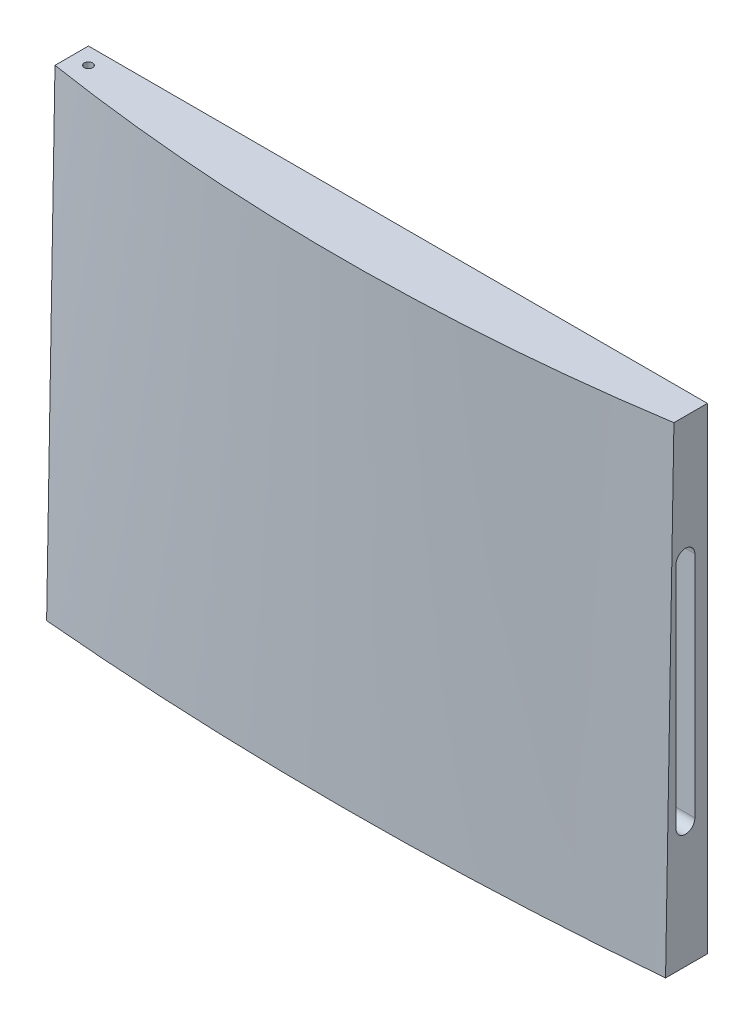
ISO-10303-21;
HEADER;
FILE_DESCRIPTION(('STEP AP214'),'2;1');
FILE_NAME('part.step','',(''),(''),'','','');
FILE_SCHEMA(('AUTOMOTIVE_DESIGN { 1 0 10303 214 1 1 1 1 }'));
ENDSEC;
DATA;
#1=APPLICATION_CONTEXT('core data for automotive mechanical design processes');
#2=APPLICATION_PROTOCOL_DEFINITION('international standard','automotive_design',2000,#1);
#3=PRODUCT_CONTEXT('',#1,'mechanical');
#4=PRODUCT('Part','Part','',(#3));
#5=PRODUCT_RELATED_PRODUCT_CATEGORY('part','',(#4));
#6=PRODUCT_DEFINITION_FORMATION('','',#4);
#7=PRODUCT_DEFINITION_CONTEXT('part definition',#1,'design');
#8=PRODUCT_DEFINITION('design','',#6,#7);
#9=PRODUCT_DEFINITION_SHAPE('','',#8);
#10=(LENGTH_UNIT() NAMED_UNIT(*) SI_UNIT(.MILLI.,.METRE.));
#11=(NAMED_UNIT(*) PLANE_ANGLE_UNIT() SI_UNIT($,.RADIAN.));
#12=(NAMED_UNIT(*) SI_UNIT($,.STERADIAN.) SOLID_ANGLE_UNIT());
#13=UNCERTAINTY_MEASURE_WITH_UNIT(LENGTH_MEASURE(1.E-05),#10,'distance_accuracy_value','');
#14=(GEOMETRIC_REPRESENTATION_CONTEXT(3) GLOBAL_UNCERTAINTY_ASSIGNED_CONTEXT((#13)) GLOBAL_UNIT_ASSIGNED_CONTEXT((#10,
#11,#12)) REPRESENTATION_CONTEXT('',''));
#15=CARTESIAN_POINT('',(0.,0.,0.));
#16=DIRECTION('',(0.,0.,1.));
#17=DIRECTION('',(1.,0.,0.));
#18=AXIS2_PLACEMENT_3D('',#15,#16,#17);
#19=CARTESIAN_POINT('',(0.,0.,0.));
#20=DIRECTION('',(0.,0.,-1.));
#21=DIRECTION('',(0.,1.,0.));
#22=AXIS2_PLACEMENT_3D('',#19,#20,#21);
#23=PLANE('',#22);
#24=DIRECTION('',(0.,-1.,0.));
#25=VECTOR('',#24,1.);
#26=CARTESIAN_POINT('',(-320.856761827083,10.,0.));
#27=LINE('',#26,#25);
#28=CARTESIAN_POINT('',(-320.856761827083,10.,0.));
#29=VERTEX_POINT('',#28);
#30=CARTESIAN_POINT('',(-320.856761827083,0.,0.));
#31=VERTEX_POINT('',#30);
#32=EDGE_CURVE('E270',#29,#31,#27,.T.);
#33=ORIENTED_EDGE('',*,*,#32,.F.);
#34=DIRECTION('',(1.,0.,0.));
#35=VECTOR('',#34,1.);
#36=CARTESIAN_POINT('',(-370.,10.,0.));
#37=LINE('',#36,#35);
#38=CARTESIAN_POINT('',(-370.,10.,0.));
#39=VERTEX_POINT('',#38);
#40=EDGE_CURVE('E267',#39,#29,#37,.T.);
#41=ORIENTED_EDGE('',*,*,#40,.F.);
#42=DIRECTION('',(0.,-1.,0.));
#43=VECTOR('',#42,1.);
#44=CARTESIAN_POINT('',(-370.,570.,0.));
#45=LINE('',#44,#43);
#46=CARTESIAN_POINT('',(-370.,570.,0.));
#47=VERTEX_POINT('',#46);
#48=EDGE_CURVE('E385',#47,#39,#45,.T.);
#49=ORIENTED_EDGE('',*,*,#48,.F.);
#50=DIRECTION('',(-1.,0.,0.));
#51=VECTOR('',#50,1.);
#52=CARTESIAN_POINT('',(-370.,570.,0.));
#53=LINE('',#52,#51);
#54=CARTESIAN_POINT('',(370.,570.,0.));
#55=VERTEX_POINT('',#54);
#56=EDGE_CURVE('E289',#55,#47,#53,.T.);
#57=ORIENTED_EDGE('',*,*,#56,.F.);
#58=DIRECTION('',(0.,-1.,0.));
#59=VECTOR('',#58,1.);
#60=CARTESIAN_POINT('',(370.,570.,0.));
#61=LINE('',#60,#59);
#62=CARTESIAN_POINT('',(370.,0.,-1.35935794705356E-13));
#63=VERTEX_POINT('',#62);
#64=EDGE_CURVE('E295',#55,#63,#61,.T.);
#65=ORIENTED_EDGE('',*,*,#64,.T.);
#66=DIRECTION('',(-1.,0.,0.));
#67=VECTOR('',#66,1.);
#68=CARTESIAN_POINT('',(-370.,0.,0.));
#69=LINE('',#68,#67);
#70=EDGE_CURVE('E460',#63,#31,#69,.T.);
#71=ORIENTED_EDGE('',*,*,#70,.T.);
#72=EDGE_LOOP('',(#33,#41,#49,#57,#65,#71));
#73=FACE_BOUND('',#72,.T.);
#74=CARTESIAN_POINT('',(335.,535.,0.));
#75=DIRECTION('',(0.,0.,-1.));
#76=DIRECTION('',(0.,1.,0.));
#77=AXIS2_PLACEMENT_3D('',#74,#75,#76);
#78=CIRCLE('',#77,20.);
#79=CARTESIAN_POINT('',(335.,555.,0.));
#80=VERTEX_POINT('',#79);
#81=CARTESIAN_POINT('',(355.,535.,0.));
#82=VERTEX_POINT('',#81);
#83=EDGE_CURVE('E499',#80,#82,#78,.T.);
#84=ORIENTED_EDGE('',*,*,#83,.F.);
#85=DIRECTION('',(1.,0.,0.));
#86=VECTOR('',#85,1.);
#87=CARTESIAN_POINT('',(0.,555.,0.));
#88=LINE('',#87,#86);
#89=CARTESIAN_POINT('',(-325.,555.,1.24092171055707E-13));
#90=VERTEX_POINT('',#89);
#91=EDGE_CURVE('E496',#80,#90,#88,.F.);
#92=ORIENTED_EDGE('',*,*,#91,.T.);
#93=CARTESIAN_POINT('',(-325.,535.,1.196959198424E-13));
#94=DIRECTION('',(0.,0.,-1.));
#95=DIRECTION('',(0.,1.,0.));
#96=AXIS2_PLACEMENT_3D('',#93,#94,#95);
#97=CIRCLE('',#96,20.);
#98=CARTESIAN_POINT('',(-345.,535.,1.22996434445944E-13));
#99=VERTEX_POINT('',#98);
#100=EDGE_CURVE('E493',#99,#90,#97,.T.);
#101=ORIENTED_EDGE('',*,*,#100,.F.);
#102=DIRECTION('',(0.,1.,0.));
#103=VECTOR('',#102,1.);
#104=CARTESIAN_POINT('',(-345.,0.,0.));
#105=LINE('',#104,#103);
#106=CARTESIAN_POINT('',(-345.,45.,0.));
#107=VERTEX_POINT('',#106);
#108=EDGE_CURVE('E489',#99,#107,#105,.F.);
#109=ORIENTED_EDGE('',*,*,#108,.T.);
#110=CARTESIAN_POINT('',(-325.,45.,0.));
#111=DIRECTION('',(0.,0.,-1.));
#112=DIRECTION('',(0.,1.,0.));
#113=AXIS2_PLACEMENT_3D('',#110,#111,#112);
#114=CIRCLE('',#113,20.);
#115=CARTESIAN_POINT('',(-325.,25.,0.));
#116=VERTEX_POINT('',#115);
#117=EDGE_CURVE('E486',#116,#107,#114,.T.);
#118=ORIENTED_EDGE('',*,*,#117,.F.);
#119=DIRECTION('',(-1.,0.,0.));
#120=VECTOR('',#119,1.);
#121=CARTESIAN_POINT('',(0.,25.,0.));
#122=LINE('',#121,#120);
#123=CARTESIAN_POINT('',(335.,24.9999999999999,-1.23544302750826E-13));
#124=VERTEX_POINT('',#123);
#125=EDGE_CURVE('E484',#116,#124,#122,.F.);
#126=ORIENTED_EDGE('',*,*,#125,.T.);
#127=CARTESIAN_POINT('',(335.,44.9999999999999,-1.17961196366423E-13));
#128=DIRECTION('',(0.,0.,-1.));
#129=DIRECTION('',(0.,1.,0.));
#130=AXIS2_PLACEMENT_3D('',#127,#128,#129);
#131=CIRCLE('',#130,20.);
#132=CARTESIAN_POINT('',(355.,44.9999999999999,-1.22448566141062E-13));
#133=VERTEX_POINT('',#132);
#134=EDGE_CURVE('E481',#133,#124,#131,.T.);
#135=ORIENTED_EDGE('',*,*,#134,.F.);
#136=DIRECTION('',(0.,-1.,0.));
#137=VECTOR('',#136,1.);
#138=CARTESIAN_POINT('',(355.,0.,-1.33180339407275E-13));
#139=LINE('',#138,#137);
#140=EDGE_CURVE('E491',#133,#82,#139,.F.);
#141=ORIENTED_EDGE('',*,*,#140,.T.);
#142=EDGE_LOOP('',(#84,#92,#101,#109,#118,#126,#135,#141));
#143=FACE_BOUND('',#142,.T.);
#144=ADVANCED_FACE('F56',(#73,#143),#23,.T.);
#145=CARTESIAN_POINT('',(-7.7715611723761E-13,0.,-4133.67063713194));
#146=DIRECTION('',(0.,1.,0.));
#147=DIRECTION('',(0.,0.,1.));
#148=AXIS2_PLACEMENT_3D('',#145,#146,#147);
#149=PLANE('',#148);
#150=DIRECTION('',(1.,0.,0.));
#151=VECTOR('',#150,1.);
#152=CARTESIAN_POINT('',(-370.,0.,25.4419169748149));
#153=LINE('',#152,#151);
#154=CARTESIAN_POINT('',(-370.,0.,25.4419169748149));
#155=VERTEX_POINT('',#154);
#156=CARTESIAN_POINT('',(-335.856761827083,0.,25.4419169748149));
#157=VERTEX_POINT('',#156);
#158=EDGE_CURVE('E254',#155,#157,#153,.T.);
#159=ORIENTED_EDGE('',*,*,#158,.T.);
#160=CARTESIAN_POINT('',(-335.856761827083,0.,10.4419169748149));
#161=DIRECTION('',(0.,1.,0.));
#162=DIRECTION('',(0.,0.,1.));
#163=AXIS2_PLACEMENT_3D('',#160,#161,#162);
#164=CIRCLE('',#163,15.);
#165=CARTESIAN_POINT('',(-320.856761827083,0.,10.4419169748148));
#166=VERTEX_POINT('',#165);
#167=EDGE_CURVE('E271',#157,#166,#164,.T.);
#168=ORIENTED_EDGE('',*,*,#167,.T.);
#169=DIRECTION('',(0.,0.,1.));
#170=VECTOR('',#169,1.);
#171=CARTESIAN_POINT('',(-320.856761827083,0.,0.));
#172=LINE('',#171,#170);
#173=EDGE_CURVE('E260',#31,#166,#172,.T.);
#174=ORIENTED_EDGE('',*,*,#173,.F.);
#175=ORIENTED_EDGE('',*,*,#70,.F.);
#176=DIRECTION('',(0.,0.,-1.));
#177=VECTOR('',#176,1.);
#178=CARTESIAN_POINT('',(370.,0.,-1.35935794705356E-13));
#179=LINE('',#178,#177);
#180=CARTESIAN_POINT('',(370.,0.,49.9999999999999));
#181=VERTEX_POINT('',#180);
#182=EDGE_CURVE('E327',#181,#63,#179,.T.);
#183=ORIENTED_EDGE('',*,*,#182,.F.);
#184=CARTESIAN_POINT('',(-7.7715611723761E-13,0.,-4133.67063713194));
#185=DIRECTION('',(0.,1.,0.));
#186=DIRECTION('',(0.,0.,1.));
#187=AXIS2_PLACEMENT_3D('',#184,#185,#186);
#188=CIRCLE('',#187,4200.);
#189=CARTESIAN_POINT('',(-370.,0.,49.9999999999989));
#190=VERTEX_POINT('',#189);
#191=EDGE_CURVE('E342',#190,#181,#188,.T.);
#192=ORIENTED_EDGE('',*,*,#191,.F.);
#193=DIRECTION('',(0.,0.,1.));
#194=VECTOR('',#193,1.);
#195=CARTESIAN_POINT('',(-370.,0.,0.));
#196=LINE('',#195,#194);
#197=EDGE_CURVE('E410',#155,#190,#196,.T.);
#198=ORIENTED_EDGE('',*,*,#197,.F.);
#199=EDGE_LOOP('',(#159,#168,#174,#175,#183,#192,#198));
#200=FACE_BOUND('',#199,.T.);
#201=ADVANCED_FACE('F306',(#200),#149,.F.);
#202=CARTESIAN_POINT('',(-370.,0.,0.));
#203=DIRECTION('',(-1.,0.,0.));
#204=DIRECTION('',(0.,0.,1.));
#205=AXIS2_PLACEMENT_3D('',#202,#203,#204);
#206=PLANE('',#205);
#207=DIRECTION('',(0.,0.,1.));
#208=VECTOR('',#207,1.);
#209=CARTESIAN_POINT('',(-370.,10.,0.));
#210=LINE('',#209,#208);
#211=CARTESIAN_POINT('',(-370.,10.,25.4419169748149));
#212=VERTEX_POINT('',#211);
#213=EDGE_CURVE('E256',#39,#212,#210,.T.);
#214=ORIENTED_EDGE('',*,*,#213,.T.);
#215=DIRECTION('',(0.,-1.,0.));
#216=VECTOR('',#215,1.);
#217=CARTESIAN_POINT('',(-370.,10.,25.4419169748149));
#218=LINE('',#217,#216);
#219=EDGE_CURVE('E278',#212,#155,#218,.T.);
#220=ORIENTED_EDGE('',*,*,#219,.T.);
#221=ORIENTED_EDGE('',*,*,#197,.T.);
#222=DIRECTION('',(0.,-0.999846142010013,0.0175411603861394));
#223=VECTOR('',#222,1.);
#224=CARTESIAN_POINT('',(-370.000000000001,285.,44.9999999999993));
#225=LINE('',#224,#223);
#226=CARTESIAN_POINT('',(-370.000000000001,570.,39.9999999999996));
#227=VERTEX_POINT('',#226);
#228=EDGE_CURVE('E378',#227,#190,#225,.T.);
#229=ORIENTED_EDGE('',*,*,#228,.F.);
#230=DIRECTION('',(0.,0.,1.));
#231=VECTOR('',#230,1.);
#232=CARTESIAN_POINT('',(-370.,570.,0.));
#233=LINE('',#232,#231);
#234=EDGE_CURVE('E282',#47,#227,#233,.T.);
#235=ORIENTED_EDGE('',*,*,#234,.F.);
#236=ORIENTED_EDGE('',*,*,#48,.T.);
#237=EDGE_LOOP('',(#214,#220,#221,#229,#235,#236));
#238=FACE_BOUND('',#237,.T.);
#239=ADVANCED_FACE('F364',(#238),#206,.T.);
#240=CARTESIAN_POINT('',(0.,570.,-2331.30765612562));
#241=DIRECTION('',(0.,1.,0.));
#242=DIRECTION('',(0.,0.,1.));
#243=AXIS2_PLACEMENT_3D('',#240,#241,#242);
#244=PLANE('',#243);
#245=CARTESIAN_POINT('',(-350.,570.,19.9999999999999));
#246=DIRECTION('',(0.,1.,0.));
#247=DIRECTION('',(0.,0.,1.));
#248=AXIS2_PLACEMENT_3D('',#245,#246,#247);
#249=CIRCLE('',#248,4.99999999999999);
#250=CARTESIAN_POINT('',(-350.,570.,24.9999999999999));
#251=VERTEX_POINT('',#250);
#252=EDGE_CURVE('E279',#251,#251,#249,.F.);
#253=ORIENTED_EDGE('',*,*,#252,.T.);
#254=EDGE_LOOP('',(#253));
#255=FACE_BOUND('',#254,.T.);
#256=ORIENTED_EDGE('',*,*,#234,.T.);
#257=CARTESIAN_POINT('',(0.,570.,-2331.30765612562));
#258=DIRECTION('',(0.,1.,0.));
#259=DIRECTION('',(0.,0.,1.));
#260=AXIS2_PLACEMENT_3D('',#257,#258,#259);
#261=CIRCLE('',#260,2400.);
#262=CARTESIAN_POINT('',(370.000000000001,570.,39.9999999999996));
#263=VERTEX_POINT('',#262);
#264=EDGE_CURVE('E404',#227,#263,#261,.T.);
#265=ORIENTED_EDGE('',*,*,#264,.T.);
#266=DIRECTION('',(0.,0.,-1.));
#267=VECTOR('',#266,1.);
#268=CARTESIAN_POINT('',(370.,570.,0.));
#269=LINE('',#268,#267);
#270=EDGE_CURVE('E416',#263,#55,#269,.T.);
#271=ORIENTED_EDGE('',*,*,#270,.T.);
#272=ORIENTED_EDGE('',*,*,#56,.T.);
#273=EDGE_LOOP('',(#256,#265,#271,#272));
#274=FACE_BOUND('',#273,.T.);
#275=ADVANCED_FACE('F361',(#255,#274),#244,.T.);
#276=CARTESIAN_POINT('',(370.000000000001,570.,39.9999999999996));
#277=CARTESIAN_POINT('',(370.000000000001,0.,49.9999999999989));
#278=CARTESIAN_POINT('',(309.070567168995,570.,49.5069444444441));
#279=CARTESIAN_POINT('',(308.573089851635,0.,55.4325396825386));
#280=CARTESIAN_POINT('',(247.591525258771,570.,56.6905729641538));
#281=CARTESIAN_POINT('',(246.966712257081,0.,59.5168537694138));
#282=CARTESIAN_POINT('',(124.074720951034,570.,66.2833367538543));
#283=CARTESIAN_POINT('',(123.573527567323,0.,64.9652692189822));
#284=CARTESIAN_POINT('',(62.0375002689213,570.,68.6923438743758));
#285=CARTESIAN_POINT('',(61.7867784196749,0.,66.3293628680557));
#286=CARTESIAN_POINT('',(-62.0375002689218,570.,68.6923438743759));
#287=CARTESIAN_POINT('',(-61.7867784196738,0.,66.3293628680557));
#288=CARTESIAN_POINT('',(-124.074720951035,570.,66.2833367538543));
#289=CARTESIAN_POINT('',(-123.573527567322,0.,64.9652692189822));
#290=CARTESIAN_POINT('',(-247.591525258772,570.,56.6905729641538));
#291=CARTESIAN_POINT('',(-246.96671225708,0.,59.5168537694137));
#292=CARTESIAN_POINT('',(-309.070567168996,570.,49.5069444444441));
#293=CARTESIAN_POINT('',(-308.573089851634,0.,55.4325396825386));
#294=CARTESIAN_POINT('',(-370.000000000001,570.,39.9999999999996));
#295=CARTESIAN_POINT('',(-370.,0.,49.9999999999989));
#296=B_SPLINE_SURFACE_WITH_KNOTS('',3,1,((#276,#277),(#278,#279),(#280,#281),(#282,#283),(#284,
#285),(#286,#287),(#288,#289),(#290,#291),(#292,#293),(#294,#295)),.UNSPECIFIED.,.F.,.F.,.F.,(4,
2,2,2,4),(2,2),(0.,0.25,0.5,0.75,1.),(0.,1.),.UNSPECIFIED.);
#297=DIRECTION('',(0.,0.999846142010013,-0.0175411603861394));
#298=VECTOR('',#297,1.);
#299=CARTESIAN_POINT('',(370.000000000001,285.,44.9999999999993));
#300=LINE('',#299,#298);
#301=EDGE_CURVE('E386',#181,#263,#300,.T.);
#302=ORIENTED_EDGE('',*,*,#264,.F.);
#303=ORIENTED_EDGE('',*,*,#228,.T.);
#304=ORIENTED_EDGE('',*,*,#191,.T.);
#305=ORIENTED_EDGE('',*,*,#301,.T.);
#306=EDGE_LOOP('',(#302,#303,#304,#305));
#307=FACE_BOUND('',#306,.T.);
#308=ADVANCED_FACE('F350',(#307),#296,.T.);
#309=CARTESIAN_POINT('',(370.,0.,0.));
#310=DIRECTION('',(1.,0.,0.));
#311=DIRECTION('',(0.,0.,-1.));
#312=AXIS2_PLACEMENT_3D('',#309,#310,#311);
#313=PLANE('',#312);
#314=CARTESIAN_POINT('',(370.,148.2,26.2500000000001));
#315=DIRECTION('',(1.,0.,0.));
#316=DIRECTION('',(0.,0.,1.));
#317=AXIS2_PLACEMENT_3D('',#314,#315,#316);
#318=CIRCLE('',#317,11.25);
#319=CARTESIAN_POINT('',(370.,148.2,37.5000000000001));
#320=VERTEX_POINT('',#319);
#321=CARTESIAN_POINT('',(370.,148.2,15.0000000000001));
#322=VERTEX_POINT('',#321);
#323=EDGE_CURVE('E236',#320,#322,#318,.T.);
#324=ORIENTED_EDGE('',*,*,#323,.F.);
#325=DIRECTION('',(0.,-1.,0.));
#326=VECTOR('',#325,1.);
#327=CARTESIAN_POINT('',(370.,148.2,37.5000000000001));
#328=LINE('',#327,#326);
#329=CARTESIAN_POINT('',(370.,421.8,37.5000000000001));
#330=VERTEX_POINT('',#329);
#331=EDGE_CURVE('E241',#330,#320,#328,.T.);
#332=ORIENTED_EDGE('',*,*,#331,.F.);
#333=CARTESIAN_POINT('',(370.,421.8,26.2500000000001));
#334=DIRECTION('',(1.,0.,0.));
#335=DIRECTION('',(0.,0.,-1.));
#336=AXIS2_PLACEMENT_3D('',#333,#334,#335);
#337=CIRCLE('',#336,11.25);
#338=CARTESIAN_POINT('',(370.,421.8,15.0000000000001));
#339=VERTEX_POINT('',#338);
#340=EDGE_CURVE('E223',#339,#330,#337,.T.);
#341=ORIENTED_EDGE('',*,*,#340,.F.);
#342=DIRECTION('',(0.,1.,0.));
#343=VECTOR('',#342,1.);
#344=CARTESIAN_POINT('',(370.,148.2,15.0000000000001));
#345=LINE('',#344,#343);
#346=EDGE_CURVE('E231',#322,#339,#345,.T.);
#347=ORIENTED_EDGE('',*,*,#346,.F.);
#348=EDGE_LOOP('',(#324,#332,#341,#347));
#349=FACE_BOUND('',#348,.T.);
#350=ORIENTED_EDGE('',*,*,#301,.F.);
#351=ORIENTED_EDGE('',*,*,#182,.T.);
#352=ORIENTED_EDGE('',*,*,#64,.F.);
#353=ORIENTED_EDGE('',*,*,#270,.F.);
#354=EDGE_LOOP('',(#350,#351,#352,#353));
#355=FACE_BOUND('',#354,.T.);
#356=ADVANCED_FACE('F238',(#349,#355),#313,.T.);
#357=CARTESIAN_POINT('',(-350.,570.009369636747,19.9999999999999));
#358=DIRECTION('',(0.,-1.,0.));
#359=DIRECTION('',(0.,0.,-1.));
#360=AXIS2_PLACEMENT_3D('',#357,#358,#359);
#361=CYLINDRICAL_SURFACE('',#360,4.99999999999999);
#362=CARTESIAN_POINT('',(-350.,10.,19.9999999999999));
#363=DIRECTION('',(0.,1.,0.));
#364=DIRECTION('',(0.,0.,1.));
#365=AXIS2_PLACEMENT_3D('',#362,#363,#364);
#366=CIRCLE('',#365,4.99999999999999);
#367=CARTESIAN_POINT('',(-350.,10.,24.9999999999999));
#368=VERTEX_POINT('',#367);
#369=EDGE_CURVE('E283',#368,#368,#366,.F.);
#370=ORIENTED_EDGE('',*,*,#369,.T.);
#371=EDGE_LOOP('',(#370));
#372=FACE_BOUND('',#371,.T.);
#373=ORIENTED_EDGE('',*,*,#252,.F.);
#374=EDGE_LOOP('',(#373));
#375=FACE_BOUND('',#374,.T.);
#376=ADVANCED_FACE('F720',(#372,#375),#361,.F.);
#377=CARTESIAN_POINT('',(-335.856761827083,10.,10.4419169748149));
#378=DIRECTION('',(0.,1.,0.));
#379=DIRECTION('',(0.,0.,1.));
#380=AXIS2_PLACEMENT_3D('',#377,#378,#379);
#381=PLANE('',#380);
#382=ORIENTED_EDGE('',*,*,#213,.F.);
#383=ORIENTED_EDGE('',*,*,#40,.T.);
#384=DIRECTION('',(0.,0.,1.));
#385=VECTOR('',#384,1.);
#386=CARTESIAN_POINT('',(-320.856761827083,10.,0.));
#387=LINE('',#386,#385);
#388=CARTESIAN_POINT('',(-320.856761827083,10.,10.4419169748148));
#389=VERTEX_POINT('',#388);
#390=EDGE_CURVE('E264',#29,#389,#387,.T.);
#391=ORIENTED_EDGE('',*,*,#390,.T.);
#392=CARTESIAN_POINT('',(-335.856761827083,10.,10.4419169748149));
#393=DIRECTION('',(0.,1.,0.));
#394=DIRECTION('',(0.,0.,1.));
#395=AXIS2_PLACEMENT_3D('',#392,#393,#394);
#396=CIRCLE('',#395,15.);
#397=CARTESIAN_POINT('',(-335.856761827083,10.,25.4419169748149));
#398=VERTEX_POINT('',#397);
#399=EDGE_CURVE('E262',#398,#389,#396,.T.);
#400=ORIENTED_EDGE('',*,*,#399,.F.);
#401=DIRECTION('',(1.,0.,0.));
#402=VECTOR('',#401,1.);
#403=CARTESIAN_POINT('',(-370.,10.,25.4419169748149));
#404=LINE('',#403,#402);
#405=EDGE_CURVE('E259',#212,#398,#404,.T.);
#406=ORIENTED_EDGE('',*,*,#405,.F.);
#407=EDGE_LOOP('',(#382,#383,#391,#400,#406));
#408=FACE_BOUND('',#407,.T.);
#409=ORIENTED_EDGE('',*,*,#369,.F.);
#410=EDGE_LOOP('',(#409));
#411=FACE_BOUND('',#410,.T.);
#412=ADVANCED_FACE('F716',(#408,#411),#381,.F.);
#413=CARTESIAN_POINT('',(-370.,10.,25.4419169748149));
#414=DIRECTION('',(0.,0.,-1.));
#415=DIRECTION('',(-1.,0.,0.));
#416=AXIS2_PLACEMENT_3D('',#413,#414,#415);
#417=PLANE('',#416);
#418=ORIENTED_EDGE('',*,*,#158,.F.);
#419=ORIENTED_EDGE('',*,*,#219,.F.);
#420=ORIENTED_EDGE('',*,*,#405,.T.);
#421=DIRECTION('',(0.,-1.,0.));
#422=VECTOR('',#421,1.);
#423=CARTESIAN_POINT('',(-335.856761827083,10.,25.4419169748149));
#424=LINE('',#423,#422);
#425=EDGE_CURVE('E276',#398,#157,#424,.T.);
#426=ORIENTED_EDGE('',*,*,#425,.T.);
#427=EDGE_LOOP('',(#418,#419,#420,#426));
#428=FACE_BOUND('',#427,.T.);
#429=ADVANCED_FACE('F719',(#428),#417,.T.);
#430=CARTESIAN_POINT('',(-335.856761827083,10.,10.4419169748149));
#431=DIRECTION('',(0.,-1.,0.));
#432=DIRECTION('',(0.,0.,-1.));
#433=AXIS2_PLACEMENT_3D('',#430,#431,#432);
#434=CYLINDRICAL_SURFACE('',#433,15.);
#435=ORIENTED_EDGE('',*,*,#167,.F.);
#436=ORIENTED_EDGE('',*,*,#425,.F.);
#437=ORIENTED_EDGE('',*,*,#399,.T.);
#438=DIRECTION('',(0.,-1.,0.));
#439=VECTOR('',#438,1.);
#440=CARTESIAN_POINT('',(-320.856761827083,10.,10.4419169748148));
#441=LINE('',#440,#439);
#442=EDGE_CURVE('E274',#389,#166,#441,.T.);
#443=ORIENTED_EDGE('',*,*,#442,.T.);
#444=EDGE_LOOP('',(#435,#436,#437,#443));
#445=FACE_BOUND('',#444,.T.);
#446=ADVANCED_FACE('F724',(#445),#434,.F.);
#447=CARTESIAN_POINT('',(-320.856761827083,10.,0.));
#448=DIRECTION('',(1.,0.,0.));
#449=DIRECTION('',(0.,0.,-1.));
#450=AXIS2_PLACEMENT_3D('',#447,#448,#449);
#451=PLANE('',#450);
#452=ORIENTED_EDGE('',*,*,#173,.T.);
#453=ORIENTED_EDGE('',*,*,#442,.F.);
#454=ORIENTED_EDGE('',*,*,#390,.F.);
#455=ORIENTED_EDGE('',*,*,#32,.T.);
#456=EDGE_LOOP('',(#452,#453,#454,#455));
#457=FACE_BOUND('',#456,.T.);
#458=ADVANCED_FACE('F712',(#457),#451,.F.);
#459=CARTESIAN_POINT('',(-335.,545.,-19.9999999999999));
#460=DIRECTION('',(0.,-1.,0.));
#461=DIRECTION('',(1.,0.,0.));
#462=AXIS2_PLACEMENT_3D('',#459,#460,#461);
#463=PLANE('',#462);
#464=DIRECTION('',(1.,0.,0.));
#465=VECTOR('',#464,1.);
#466=CARTESIAN_POINT('',(-335.,545.,-9.99999999999988));
#467=LINE('',#466,#465);
#468=CARTESIAN_POINT('',(-325.,545.,-9.99999999999988));
#469=VERTEX_POINT('',#468);
#470=CARTESIAN_POINT('',(335.,545.,-10.));
#471=VERTEX_POINT('',#470);
#472=EDGE_CURVE('E476',#469,#471,#467,.T.);
#473=ORIENTED_EDGE('',*,*,#472,.T.);
#474=DIRECTION('',(0.,0.,1.));
#475=VECTOR('',#474,1.);
#476=CARTESIAN_POINT('',(335.,545.,-20.));
#477=LINE('',#476,#475);
#478=CARTESIAN_POINT('',(335.,545.,-20.));
#479=VERTEX_POINT('',#478);
#480=EDGE_CURVE('E479',#471,#479,#477,.F.);
#481=ORIENTED_EDGE('',*,*,#480,.T.);
#482=DIRECTION('',(1.,0.,0.));
#483=VECTOR('',#482,1.);
#484=CARTESIAN_POINT('',(-335.,545.,-19.9999999999999));
#485=LINE('',#484,#483);
#486=CARTESIAN_POINT('',(-325.,545.,-19.9999999999999));
#487=VERTEX_POINT('',#486);
#488=EDGE_CURVE('E251',#487,#479,#485,.T.);
#489=ORIENTED_EDGE('',*,*,#488,.F.);
#490=DIRECTION('',(0.,0.,1.));
#491=VECTOR('',#490,1.);
#492=CARTESIAN_POINT('',(-325.,545.,-19.9999999999999));
#493=LINE('',#492,#491);
#494=EDGE_CURVE('E463',#487,#469,#493,.T.);
#495=ORIENTED_EDGE('',*,*,#494,.T.);
#496=EDGE_LOOP('',(#473,#481,#489,#495));
#497=FACE_BOUND('',#496,.T.);
#498=ADVANCED_FACE('F689',(#497),#463,.F.);
#499=CARTESIAN_POINT('',(0.,0.,-20.));
#500=DIRECTION('',(0.,0.,-1.));
#501=DIRECTION('',(-1.,0.,0.));
#502=AXIS2_PLACEMENT_3D('',#499,#500,#501);
#503=PLANE('',#502);
#504=ORIENTED_EDGE('',*,*,#488,.T.);
#505=DIRECTION('',(0.,-1.,0.));
#506=VECTOR('',#505,1.);
#507=CARTESIAN_POINT('',(335.,34.9999999999999,-20.0000000000001));
#508=LINE('',#507,#506);
#509=CARTESIAN_POINT('',(335.,44.9999999999999,-20.0000000000001));
#510=VERTEX_POINT('',#509);
#511=EDGE_CURVE('E506',#479,#510,#508,.T.);
#512=ORIENTED_EDGE('',*,*,#511,.T.);
#513=DIRECTION('',(-1.,0.,0.));
#514=VECTOR('',#513,1.);
#515=CARTESIAN_POINT('',(-335.,45.,-19.9999999999999));
#516=LINE('',#515,#514);
#517=CARTESIAN_POINT('',(-325.,45.,-19.9999999999999));
#518=VERTEX_POINT('',#517);
#519=EDGE_CURVE('E502',#510,#518,#516,.T.);
#520=ORIENTED_EDGE('',*,*,#519,.T.);
#521=DIRECTION('',(0.,1.,0.));
#522=VECTOR('',#521,1.);
#523=CARTESIAN_POINT('',(-325.,545.,-19.9999999999999));
#524=LINE('',#523,#522);
#525=EDGE_CURVE('E504',#518,#487,#524,.T.);
#526=ORIENTED_EDGE('',*,*,#525,.T.);
#527=EDGE_LOOP('',(#504,#512,#520,#526));
#528=FACE_BOUND('',#527,.T.);
#529=ADVANCED_FACE('F618',(#528),#503,.T.);
#530=CARTESIAN_POINT('',(0.,45.,-9.99999999999999));
#531=DIRECTION('',(1.,0.,0.));
#532=DIRECTION('',(0.,0.,-1.));
#533=AXIS2_PLACEMENT_3D('',#530,#531,#532);
#534=CYLINDRICAL_SURFACE('',#533,10.);
#535=DIRECTION('',(-1.,0.,0.));
#536=VECTOR('',#535,1.);
#537=CARTESIAN_POINT('',(345.,34.9999999999999,-10.0000000000001));
#538=LINE('',#537,#536);
#539=CARTESIAN_POINT('',(-325.,35.,-9.99999999999994));
#540=VERTEX_POINT('',#539);
#541=CARTESIAN_POINT('',(335.,34.9999999999999,-10.0000000000001));
#542=VERTEX_POINT('',#541);
#543=EDGE_CURVE('E556',#540,#542,#538,.F.);
#544=ORIENTED_EDGE('',*,*,#543,.F.);
#545=CARTESIAN_POINT('',(-325.,45.,-9.99999999999993));
#546=DIRECTION('',(-1.,0.,0.));
#547=DIRECTION('',(0.,0.,1.));
#548=AXIS2_PLACEMENT_3D('',#545,#546,#547);
#549=CIRCLE('',#548,10.);
#550=EDGE_CURVE('E255',#518,#540,#549,.T.);
#551=ORIENTED_EDGE('',*,*,#550,.F.);
#552=ORIENTED_EDGE('',*,*,#519,.F.);
#553=CARTESIAN_POINT('',(335.,44.9999999999999,-10.0000000000001));
#554=DIRECTION('',(1.,0.,0.));
#555=DIRECTION('',(0.,0.,-1.));
#556=AXIS2_PLACEMENT_3D('',#553,#554,#555);
#557=CIRCLE('',#556,10.);
#558=EDGE_CURVE('E562',#542,#510,#557,.T.);
#559=ORIENTED_EDGE('',*,*,#558,.F.);
#560=EDGE_LOOP('',(#544,#551,#552,#559));
#561=FACE_BOUND('',#560,.T.);
#562=ADVANCED_FACE('F614',(#561),#534,.T.);
#563=CARTESIAN_POINT('',(-325.,45.,-9.99999999999993));
#564=DIRECTION('',(0.,0.,1.));
#565=DIRECTION('',(1.,0.,0.));
#566=AXIS2_PLACEMENT_3D('',#563,#564,#565);
#567=SPHERICAL_SURFACE('',#566,10.);
#568=ORIENTED_EDGE('',*,*,#550,.T.);
#569=CARTESIAN_POINT('',(-325.,45.,-10.));
#570=DIRECTION('',(0.,0.,-1.));
#571=DIRECTION('',(0.,1.,0.));
#572=AXIS2_PLACEMENT_3D('',#569,#570,#571);
#573=CIRCLE('',#572,10.);
#574=CARTESIAN_POINT('',(-335.,45.,-10.));
#575=VERTEX_POINT('',#574);
#576=EDGE_CURVE('E551',#575,#540,#573,.F.);
#577=ORIENTED_EDGE('',*,*,#576,.F.);
#578=CARTESIAN_POINT('',(-325.,45.,-9.99999999999993));
#579=DIRECTION('',(0.,-1.,0.));
#580=DIRECTION('',(0.,0.,-1.));
#581=AXIS2_PLACEMENT_3D('',#578,#579,#580);
#582=CIRCLE('',#581,10.);
#583=EDGE_CURVE('E548',#518,#575,#582,.F.);
#584=ORIENTED_EDGE('',*,*,#583,.F.);
#585=EDGE_LOOP('',(#568,#577,#584));
#586=FACE_BOUND('',#585,.T.);
#587=ADVANCED_FACE('F617',(#586),#567,.T.);
#588=CARTESIAN_POINT('',(335.,44.9999999999999,-10.0000000000001));
#589=DIRECTION('',(0.,0.,1.));
#590=DIRECTION('',(1.,0.,0.));
#591=AXIS2_PLACEMENT_3D('',#588,#589,#590);
#592=SPHERICAL_SURFACE('',#591,10.);
#593=CARTESIAN_POINT('',(335.,44.9999999999999,-10.0000000000001));
#594=DIRECTION('',(0.,0.,-1.));
#595=DIRECTION('',(0.,1.,0.));
#596=AXIS2_PLACEMENT_3D('',#593,#594,#595);
#597=CIRCLE('',#596,10.);
#598=CARTESIAN_POINT('',(345.,44.9999999999999,-10.0000000000001));
#599=VERTEX_POINT('',#598);
#600=EDGE_CURVE('E559',#542,#599,#597,.F.);
#601=ORIENTED_EDGE('',*,*,#600,.F.);
#602=ORIENTED_EDGE('',*,*,#558,.T.);
#603=CARTESIAN_POINT('',(335.,44.9999999999999,-10.0000000000001));
#604=DIRECTION('',(0.,-1.,0.));
#605=DIRECTION('',(0.,0.,-1.));
#606=AXIS2_PLACEMENT_3D('',#603,#604,#605);
#607=CIRCLE('',#606,10.);
#608=EDGE_CURVE('E545',#599,#510,#607,.F.);
#609=ORIENTED_EDGE('',*,*,#608,.F.);
#610=EDGE_LOOP('',(#601,#602,#609));
#611=FACE_BOUND('',#610,.T.);
#612=ADVANCED_FACE('F622',(#611),#592,.T.);
#613=CARTESIAN_POINT('',(-335.,25.,-10.));
#614=DIRECTION('',(-1.,0.,0.));
#615=DIRECTION('',(0.,0.,1.));
#616=AXIS2_PLACEMENT_3D('',#613,#614,#615);
#617=CYLINDRICAL_SURFACE('',#616,10.);
#618=CARTESIAN_POINT('',(335.,24.9999999999999,-10.0000000000001));
#619=DIRECTION('',(-1.,0.,0.));
#620=DIRECTION('',(0.,0.,1.));
#621=AXIS2_PLACEMENT_3D('',#618,#619,#620);
#622=CIRCLE('',#621,10.);
#623=EDGE_CURVE('E542',#124,#542,#622,.T.);
#624=ORIENTED_EDGE('',*,*,#623,.F.);
#625=ORIENTED_EDGE('',*,*,#125,.F.);
#626=CARTESIAN_POINT('',(-325.,25.,-10.));
#627=DIRECTION('',(1.,0.,0.));
#628=DIRECTION('',(0.,0.,-1.));
#629=AXIS2_PLACEMENT_3D('',#626,#627,#628);
#630=CIRCLE('',#629,10.);
#631=EDGE_CURVE('E553',#540,#116,#630,.T.);
#632=ORIENTED_EDGE('',*,*,#631,.F.);
#633=ORIENTED_EDGE('',*,*,#543,.T.);
#634=EDGE_LOOP('',(#624,#625,#632,#633));
#635=FACE_BOUND('',#634,.T.);
#636=ADVANCED_FACE('F626',(#635),#617,.F.);
#637=CARTESIAN_POINT('',(-325.,45.,-10.));
#638=DIRECTION('',(0.,0.,-1.));
#639=DIRECTION('',(0.,1.,0.));
#640=AXIS2_PLACEMENT_3D('',#637,#638,#639);
#641=TOROIDAL_SURFACE('',#640,20.,10.);
#642=ORIENTED_EDGE('',*,*,#631,.T.);
#643=ORIENTED_EDGE('',*,*,#117,.T.);
#644=CARTESIAN_POINT('',(-345.,45.,-9.99999999999999));
#645=DIRECTION('',(0.,1.,0.));
#646=DIRECTION('',(0.,0.,1.));
#647=AXIS2_PLACEMENT_3D('',#644,#645,#646);
#648=CIRCLE('',#647,10.);
#649=EDGE_CURVE('E539',#575,#107,#648,.F.);
#650=ORIENTED_EDGE('',*,*,#649,.F.);
#651=ORIENTED_EDGE('',*,*,#576,.T.);
#652=EDGE_LOOP('',(#642,#643,#650,#651));
#653=FACE_BOUND('',#652,.T.);
#654=ADVANCED_FACE('F630',(#653),#641,.F.);
#655=CARTESIAN_POINT('',(-325.,0.,-9.99999999999994));
#656=DIRECTION('',(0.,-1.,0.));
#657=DIRECTION('',(0.,0.,-1.));
#658=AXIS2_PLACEMENT_3D('',#655,#656,#657);
#659=CYLINDRICAL_SURFACE('',#658,10.);
#660=ORIENTED_EDGE('',*,*,#525,.F.);
#661=ORIENTED_EDGE('',*,*,#583,.T.);
#662=DIRECTION('',(0.,1.,0.));
#663=VECTOR('',#662,1.);
#664=CARTESIAN_POINT('',(-335.,35.,-9.99999999999993));
#665=LINE('',#664,#663);
#666=CARTESIAN_POINT('',(-335.,535.,-9.99999999999988));
#667=VERTEX_POINT('',#666);
#668=EDGE_CURVE('E536',#667,#575,#665,.F.);
#669=ORIENTED_EDGE('',*,*,#668,.F.);
#670=CARTESIAN_POINT('',(-325.,535.,-9.99999999999987));
#671=DIRECTION('',(0.,0.707106781186547,0.707106781186548));
#672=DIRECTION('',(0.,-0.707106781186548,0.707106781186547));
#673=AXIS2_PLACEMENT_3D('',#670,#671,#672);
#674=ELLIPSE('',#673,14.1421356237309,10.);
#675=EDGE_CURVE('E533',#487,#667,#674,.T.);
#676=ORIENTED_EDGE('',*,*,#675,.F.);
#677=EDGE_LOOP('',(#660,#661,#669,#676));
#678=FACE_BOUND('',#677,.T.);
#679=ADVANCED_FACE('F634',(#678),#659,.T.);
#680=CARTESIAN_POINT('',(335.,0.,-10.0000000000001));
#681=DIRECTION('',(0.,1.,0.));
#682=DIRECTION('',(0.,0.,1.));
#683=AXIS2_PLACEMENT_3D('',#680,#681,#682);
#684=CYLINDRICAL_SURFACE('',#683,10.);
#685=ORIENTED_EDGE('',*,*,#608,.T.);
#686=ORIENTED_EDGE('',*,*,#511,.F.);
#687=CARTESIAN_POINT('',(335.,535.,-9.99999999999999));
#688=DIRECTION('',(0.,0.707106781186547,0.707106781186548));
#689=DIRECTION('',(0.,0.707106781186548,-0.707106781186547));
#690=AXIS2_PLACEMENT_3D('',#687,#688,#689);
#691=ELLIPSE('',#690,14.1421356237309,10.);
#692=CARTESIAN_POINT('',(345.,535.,-10.));
#693=VERTEX_POINT('',#692);
#694=EDGE_CURVE('E530',#693,#479,#691,.T.);
#695=ORIENTED_EDGE('',*,*,#694,.F.);
#696=DIRECTION('',(0.,-1.,0.));
#697=VECTOR('',#696,1.);
#698=CARTESIAN_POINT('',(345.,545.,-9.99999999999999));
#699=LINE('',#698,#697);
#700=EDGE_CURVE('E527',#599,#693,#699,.F.);
#701=ORIENTED_EDGE('',*,*,#700,.F.);
#702=EDGE_LOOP('',(#685,#686,#695,#701));
#703=FACE_BOUND('',#702,.T.);
#704=ADVANCED_FACE('F638',(#703),#684,.T.);
#705=CARTESIAN_POINT('',(335.,44.9999999999999,-10.0000000000001));
#706=DIRECTION('',(0.,0.,-1.));
#707=DIRECTION('',(0.,1.,0.));
#708=AXIS2_PLACEMENT_3D('',#705,#706,#707);
#709=TOROIDAL_SURFACE('',#708,20.,10.);
#710=ORIENTED_EDGE('',*,*,#623,.T.);
#711=ORIENTED_EDGE('',*,*,#600,.T.);
#712=CARTESIAN_POINT('',(355.,44.9999999999999,-10.0000000000001));
#713=DIRECTION('',(0.,1.,0.));
#714=DIRECTION('',(0.,0.,1.));
#715=AXIS2_PLACEMENT_3D('',#712,#713,#714);
#716=CIRCLE('',#715,10.);
#717=EDGE_CURVE('E524',#133,#599,#716,.F.);
#718=ORIENTED_EDGE('',*,*,#717,.F.);
#719=ORIENTED_EDGE('',*,*,#134,.T.);
#720=EDGE_LOOP('',(#710,#711,#718,#719));
#721=FACE_BOUND('',#720,.T.);
#722=ADVANCED_FACE('F642',(#721),#709,.F.);
#723=CARTESIAN_POINT('',(-345.,35.,-10.));
#724=DIRECTION('',(0.,1.,0.));
#725=DIRECTION('',(0.,0.,1.));
#726=AXIS2_PLACEMENT_3D('',#723,#724,#725);
#727=CYLINDRICAL_SURFACE('',#726,10.);
#728=ORIENTED_EDGE('',*,*,#649,.T.);
#729=ORIENTED_EDGE('',*,*,#108,.F.);
#730=CARTESIAN_POINT('',(-345.,535.,-9.99999999999988));
#731=DIRECTION('',(0.,-1.,0.));
#732=DIRECTION('',(0.,0.,-1.));
#733=AXIS2_PLACEMENT_3D('',#730,#731,#732);
#734=CIRCLE('',#733,10.);
#735=EDGE_CURVE('E521',#667,#99,#734,.T.);
#736=ORIENTED_EDGE('',*,*,#735,.F.);
#737=ORIENTED_EDGE('',*,*,#668,.T.);
#738=EDGE_LOOP('',(#728,#729,#736,#737));
#739=FACE_BOUND('',#738,.T.);
#740=ADVANCED_FACE('F646',(#739),#727,.F.);
#741=CARTESIAN_POINT('',(-325.,535.,-19.9999999999999));
#742=DIRECTION('',(0.,0.,1.));
#743=DIRECTION('',(1.,0.,0.));
#744=AXIS2_PLACEMENT_3D('',#741,#742,#743);
#745=CYLINDRICAL_SURFACE('',#744,10.);
#746=ORIENTED_EDGE('',*,*,#494,.F.);
#747=ORIENTED_EDGE('',*,*,#675,.T.);
#748=CARTESIAN_POINT('',(-325.,535.,-9.99999999999988));
#749=DIRECTION('',(0.,0.,-1.));
#750=DIRECTION('',(0.,1.,0.));
#751=AXIS2_PLACEMENT_3D('',#748,#749,#750);
#752=CIRCLE('',#751,10.);
#753=EDGE_CURVE('E518',#469,#667,#752,.F.);
#754=ORIENTED_EDGE('',*,*,#753,.F.);
#755=EDGE_LOOP('',(#746,#747,#754));
#756=FACE_BOUND('',#755,.T.);
#757=ADVANCED_FACE('F650',(#756),#745,.T.);
#758=CARTESIAN_POINT('',(335.,535.,-20.));
#759=DIRECTION('',(0.,0.,1.));
#760=DIRECTION('',(1.,0.,0.));
#761=AXIS2_PLACEMENT_3D('',#758,#759,#760);
#762=CYLINDRICAL_SURFACE('',#761,10.);
#763=ORIENTED_EDGE('',*,*,#694,.T.);
#764=ORIENTED_EDGE('',*,*,#480,.F.);
#765=CARTESIAN_POINT('',(335.,535.,-10.));
#766=DIRECTION('',(0.,0.,-1.));
#767=DIRECTION('',(0.,1.,0.));
#768=AXIS2_PLACEMENT_3D('',#765,#766,#767);
#769=CIRCLE('',#768,10.);
#770=EDGE_CURVE('E515',#693,#471,#769,.F.);
#771=ORIENTED_EDGE('',*,*,#770,.F.);
#772=EDGE_LOOP('',(#763,#764,#771));
#773=FACE_BOUND('',#772,.T.);
#774=ADVANCED_FACE('F654',(#773),#762,.T.);
#775=CARTESIAN_POINT('',(355.,34.9999999999999,-10.0000000000001));
#776=DIRECTION('',(0.,-1.,0.));
#777=DIRECTION('',(0.,0.,-1.));
#778=AXIS2_PLACEMENT_3D('',#775,#776,#777);
#779=CYLINDRICAL_SURFACE('',#778,10.);
#780=ORIENTED_EDGE('',*,*,#717,.T.);
#781=ORIENTED_EDGE('',*,*,#700,.T.);
#782=CARTESIAN_POINT('',(355.,535.,-10.));
#783=DIRECTION('',(0.,-1.,0.));
#784=DIRECTION('',(0.,0.,-1.));
#785=AXIS2_PLACEMENT_3D('',#782,#783,#784);
#786=CIRCLE('',#785,10.);
#787=EDGE_CURVE('E512',#82,#693,#786,.T.);
#788=ORIENTED_EDGE('',*,*,#787,.F.);
#789=ORIENTED_EDGE('',*,*,#140,.F.);
#790=EDGE_LOOP('',(#780,#781,#788,#789));
#791=FACE_BOUND('',#790,.T.);
#792=ADVANCED_FACE('F658',(#791),#779,.F.);
#793=CARTESIAN_POINT('',(-325.,535.,-9.99999999999988));
#794=DIRECTION('',(0.,0.,-1.));
#795=DIRECTION('',(0.,1.,0.));
#796=AXIS2_PLACEMENT_3D('',#793,#794,#795);
#797=TOROIDAL_SURFACE('',#796,20.,10.);
#798=ORIENTED_EDGE('',*,*,#735,.T.);
#799=ORIENTED_EDGE('',*,*,#100,.T.);
#800=CARTESIAN_POINT('',(-325.,555.,-9.99999999999988));
#801=DIRECTION('',(1.,0.,0.));
#802=DIRECTION('',(0.,0.,-1.));
#803=AXIS2_PLACEMENT_3D('',#800,#801,#802);
#804=CIRCLE('',#803,10.);
#805=EDGE_CURVE('E510',#469,#90,#804,.F.);
#806=ORIENTED_EDGE('',*,*,#805,.F.);
#807=ORIENTED_EDGE('',*,*,#753,.T.);
#808=EDGE_LOOP('',(#798,#799,#806,#807));
#809=FACE_BOUND('',#808,.T.);
#810=ADVANCED_FACE('F662',(#809),#797,.F.);
#811=CARTESIAN_POINT('',(335.,535.,-10.));
#812=DIRECTION('',(0.,0.,-1.));
#813=DIRECTION('',(0.,1.,0.));
#814=AXIS2_PLACEMENT_3D('',#811,#812,#813);
#815=TOROIDAL_SURFACE('',#814,20.,10.);
#816=ORIENTED_EDGE('',*,*,#787,.T.);
#817=ORIENTED_EDGE('',*,*,#770,.T.);
#818=CARTESIAN_POINT('',(335.,555.,-10.));
#819=DIRECTION('',(-1.,0.,0.));
#820=DIRECTION('',(0.,0.,1.));
#821=AXIS2_PLACEMENT_3D('',#818,#819,#820);
#822=CIRCLE('',#821,10.);
#823=EDGE_CURVE('E248',#80,#471,#822,.F.);
#824=ORIENTED_EDGE('',*,*,#823,.F.);
#825=ORIENTED_EDGE('',*,*,#83,.T.);
#826=EDGE_LOOP('',(#816,#817,#824,#825));
#827=FACE_BOUND('',#826,.T.);
#828=ADVANCED_FACE('F666',(#827),#815,.F.);
#829=CARTESIAN_POINT('',(-335.,555.,-9.99999999999987));
#830=DIRECTION('',(1.,0.,0.));
#831=DIRECTION('',(0.,0.,-1.));
#832=AXIS2_PLACEMENT_3D('',#829,#830,#831);
#833=CYLINDRICAL_SURFACE('',#832,10.);
#834=ORIENTED_EDGE('',*,*,#805,.T.);
#835=ORIENTED_EDGE('',*,*,#91,.F.);
#836=ORIENTED_EDGE('',*,*,#823,.T.);
#837=ORIENTED_EDGE('',*,*,#472,.F.);
#838=EDGE_LOOP('',(#834,#835,#836,#837));
#839=FACE_BOUND('',#838,.T.);
#840=ADVANCED_FACE('F669',(#839),#833,.F.);
#841=CARTESIAN_POINT('',(335.,148.2,26.2500000000001));
#842=DIRECTION('',(1.,0.,0.));
#843=DIRECTION('',(0.,0.,-1.));
#844=AXIS2_PLACEMENT_3D('',#841,#842,#843);
#845=CYLINDRICAL_SURFACE('',#844,11.25);
#846=DIRECTION('',(1.,0.,0.));
#847=VECTOR('',#846,1.);
#848=CARTESIAN_POINT('',(335.,148.2,15.0000000000001));
#849=LINE('',#848,#847);
#850=CARTESIAN_POINT('',(345.,148.2,15.0000000000001));
#851=VERTEX_POINT('',#850);
#852=EDGE_CURVE('E228',#851,#322,#849,.T.);
#853=ORIENTED_EDGE('',*,*,#852,.F.);
#854=CARTESIAN_POINT('',(345.,148.2,26.2500000000001));
#855=DIRECTION('',(-1.,0.,0.));
#856=DIRECTION('',(0.,0.,1.));
#857=AXIS2_PLACEMENT_3D('',#854,#855,#856);
#858=CIRCLE('',#857,11.25);
#859=CARTESIAN_POINT('',(345.,148.2,37.5000000000001));
#860=VERTEX_POINT('',#859);
#861=EDGE_CURVE('E65',#851,#860,#858,.T.);
#862=ORIENTED_EDGE('',*,*,#861,.T.);
#863=DIRECTION('',(1.,0.,0.));
#864=VECTOR('',#863,1.);
#865=CARTESIAN_POINT('',(335.,148.2,37.5000000000001));
#866=LINE('',#865,#864);
#867=EDGE_CURVE('E246',#860,#320,#866,.T.);
#868=ORIENTED_EDGE('',*,*,#867,.T.);
#869=ORIENTED_EDGE('',*,*,#323,.T.);
#870=EDGE_LOOP('',(#853,#862,#868,#869));
#871=FACE_BOUND('',#870,.T.);
#872=ADVANCED_FACE('F591',(#871),#845,.F.);
#873=CARTESIAN_POINT('',(335.,148.2,37.5000000000001));
#874=DIRECTION('',(0.,0.,1.));
#875=DIRECTION('',(0.,-1.,0.));
#876=AXIS2_PLACEMENT_3D('',#873,#874,#875);
#877=PLANE('',#876);
#878=ORIENTED_EDGE('',*,*,#867,.F.);
#879=DIRECTION('',(0.,-1.,0.));
#880=VECTOR('',#879,1.);
#881=CARTESIAN_POINT('',(345.,421.8,37.5000000000001));
#882=LINE('',#881,#880);
#883=CARTESIAN_POINT('',(345.,421.8,37.5000000000001));
#884=VERTEX_POINT('',#883);
#885=EDGE_CURVE('E12',#860,#884,#882,.F.);
#886=ORIENTED_EDGE('',*,*,#885,.T.);
#887=DIRECTION('',(1.,0.,0.));
#888=VECTOR('',#887,1.);
#889=CARTESIAN_POINT('',(335.,421.8,37.5000000000001));
#890=LINE('',#889,#888);
#891=EDGE_CURVE('E227',#884,#330,#890,.T.);
#892=ORIENTED_EDGE('',*,*,#891,.T.);
#893=ORIENTED_EDGE('',*,*,#331,.T.);
#894=EDGE_LOOP('',(#878,#886,#892,#893));
#895=FACE_BOUND('',#894,.T.);
#896=ADVANCED_FACE('F593',(#895),#877,.F.);
#897=CARTESIAN_POINT('',(335.,421.8,26.2500000000001));
#898=DIRECTION('',(1.,0.,0.));
#899=DIRECTION('',(0.,0.,-1.));
#900=AXIS2_PLACEMENT_3D('',#897,#898,#899);
#901=CYLINDRICAL_SURFACE('',#900,11.25);
#902=ORIENTED_EDGE('',*,*,#891,.F.);
#903=CARTESIAN_POINT('',(345.,421.8,26.2500000000001));
#904=DIRECTION('',(-1.,0.,0.));
#905=DIRECTION('',(0.,0.,1.));
#906=AXIS2_PLACEMENT_3D('',#903,#904,#905);
#907=CIRCLE('',#906,11.25);
#908=CARTESIAN_POINT('',(345.,421.8,15.0000000000001));
#909=VERTEX_POINT('',#908);
#910=EDGE_CURVE('E226',#884,#909,#907,.T.);
#911=ORIENTED_EDGE('',*,*,#910,.T.);
#912=DIRECTION('',(1.,0.,0.));
#913=VECTOR('',#912,1.);
#914=CARTESIAN_POINT('',(335.,421.8,15.0000000000001));
#915=LINE('',#914,#913);
#916=EDGE_CURVE('E218',#909,#339,#915,.T.);
#917=ORIENTED_EDGE('',*,*,#916,.T.);
#918=ORIENTED_EDGE('',*,*,#340,.T.);
#919=EDGE_LOOP('',(#902,#911,#917,#918));
#920=FACE_BOUND('',#919,.T.);
#921=ADVANCED_FACE('F221',(#920),#901,.F.);
#922=CARTESIAN_POINT('',(335.,148.2,15.0000000000001));
#923=DIRECTION('',(0.,0.,-1.));
#924=DIRECTION('',(0.,1.,0.));
#925=AXIS2_PLACEMENT_3D('',#922,#923,#924);
#926=PLANE('',#925);
#927=ORIENTED_EDGE('',*,*,#916,.F.);
#928=DIRECTION('',(0.,1.,0.));
#929=VECTOR('',#928,1.);
#930=CARTESIAN_POINT('',(345.,148.2,15.0000000000001));
#931=LINE('',#930,#929);
#932=EDGE_CURVE('E80',#909,#851,#931,.F.);
#933=ORIENTED_EDGE('',*,*,#932,.T.);
#934=ORIENTED_EDGE('',*,*,#852,.T.);
#935=ORIENTED_EDGE('',*,*,#346,.T.);
#936=EDGE_LOOP('',(#927,#933,#934,#935));
#937=FACE_BOUND('',#936,.T.);
#938=ADVANCED_FACE('F232',(#937),#926,.F.);
#939=CARTESIAN_POINT('',(335.,148.2,26.2500000000001));
#940=DIRECTION('',(-1.,0.,0.));
#941=DIRECTION('',(0.,0.,1.));
#942=AXIS2_PLACEMENT_3D('',#939,#940,#941);
#943=PLANE('',#942);
#944=DIRECTION('',(0.,1.,0.));
#945=VECTOR('',#944,1.);
#946=CARTESIAN_POINT('',(335.,421.8,25.0000000000001));
#947=LINE('',#946,#945);
#948=CARTESIAN_POINT('',(335.,148.2,25.0000000000001));
#949=VERTEX_POINT('',#948);
#950=CARTESIAN_POINT('',(335.,421.8,25.0000000000001));
#951=VERTEX_POINT('',#950);
#952=EDGE_CURVE('E570',#949,#951,#947,.T.);
#953=ORIENTED_EDGE('',*,*,#952,.T.);
#954=CARTESIAN_POINT('',(335.,421.8,26.2500000000001));
#955=DIRECTION('',(-1.,0.,0.));
#956=DIRECTION('',(0.,0.,1.));
#957=AXIS2_PLACEMENT_3D('',#954,#955,#956);
#958=CIRCLE('',#957,1.25);
#959=CARTESIAN_POINT('',(335.,421.8,27.5000000000001));
#960=VERTEX_POINT('',#959);
#961=EDGE_CURVE('E572',#951,#960,#958,.F.);
#962=ORIENTED_EDGE('',*,*,#961,.T.);
#963=DIRECTION('',(0.,-1.,0.));
#964=VECTOR('',#963,1.);
#965=CARTESIAN_POINT('',(335.,148.2,27.5000000000001));
#966=LINE('',#965,#964);
#967=CARTESIAN_POINT('',(335.,148.2,27.5000000000001));
#968=VERTEX_POINT('',#967);
#969=EDGE_CURVE('E508',#960,#968,#966,.T.);
#970=ORIENTED_EDGE('',*,*,#969,.T.);
#971=CARTESIAN_POINT('',(335.,148.2,26.2500000000001));
#972=DIRECTION('',(-1.,0.,0.));
#973=DIRECTION('',(0.,0.,1.));
#974=AXIS2_PLACEMENT_3D('',#971,#972,#973);
#975=CIRCLE('',#974,1.25);
#976=EDGE_CURVE('E568',#968,#949,#975,.F.);
#977=ORIENTED_EDGE('',*,*,#976,.T.);
#978=EDGE_LOOP('',(#953,#962,#970,#977));
#979=FACE_BOUND('',#978,.T.);
#980=ADVANCED_FACE('F602',(#979),#943,.F.);
#981=CARTESIAN_POINT('',(345.,148.2,26.2500000000001));
#982=DIRECTION('',(-1.,0.,0.));
#983=DIRECTION('',(0.,0.,1.));
#984=AXIS2_PLACEMENT_3D('',#981,#982,#983);
#985=DEGENERATE_TOROIDAL_SURFACE('',#984,1.25,10.,.T.);
#986=CARTESIAN_POINT('',(345.,148.2,27.5000000000001));
#987=DIRECTION('',(0.,-1.,0.));
#988=DIRECTION('',(0.,0.,-1.));
#989=AXIS2_PLACEMENT_3D('',#986,#987,#988);
#990=CIRCLE('',#989,10.);
#991=EDGE_CURVE('E581',#860,#968,#990,.T.);
#992=ORIENTED_EDGE('',*,*,#991,.F.);
#993=ORIENTED_EDGE('',*,*,#861,.F.);
#994=CARTESIAN_POINT('',(345.,148.2,25.0000000000001));
#995=DIRECTION('',(0.,-1.,0.));
#996=DIRECTION('',(0.,0.,-1.));
#997=AXIS2_PLACEMENT_3D('',#994,#995,#996);
#998=CIRCLE('',#997,10.);
#999=EDGE_CURVE('E60',#949,#851,#998,.T.);
#1000=ORIENTED_EDGE('',*,*,#999,.F.);
#1001=ORIENTED_EDGE('',*,*,#976,.F.);
#1002=EDGE_LOOP('',(#992,#993,#1000,#1001));
#1003=FACE_BOUND('',#1002,.T.);
#1004=ADVANCED_FACE('F58',(#1003),#985,.F.);
#1005=CARTESIAN_POINT('',(345.,148.2,25.0000000000001));
#1006=DIRECTION('',(0.,-1.,0.));
#1007=DIRECTION('',(0.,0.,-1.));
#1008=AXIS2_PLACEMENT_3D('',#1005,#1006,#1007);
#1009=CYLINDRICAL_SURFACE('',#1008,10.);
#1010=ORIENTED_EDGE('',*,*,#999,.T.);
#1011=ORIENTED_EDGE('',*,*,#932,.F.);
#1012=CARTESIAN_POINT('',(345.,421.8,25.0000000000001));
#1013=DIRECTION('',(0.,-1.,0.));
#1014=DIRECTION('',(0.,0.,-1.));
#1015=AXIS2_PLACEMENT_3D('',#1012,#1013,#1014);
#1016=CIRCLE('',#1015,10.);
#1017=EDGE_CURVE('E580',#951,#909,#1016,.T.);
#1018=ORIENTED_EDGE('',*,*,#1017,.F.);
#1019=ORIENTED_EDGE('',*,*,#952,.F.);
#1020=EDGE_LOOP('',(#1010,#1011,#1018,#1019));
#1021=FACE_BOUND('',#1020,.T.);
#1022=ADVANCED_FACE('F603',(#1021),#1009,.F.);
#1023=CARTESIAN_POINT('',(345.,148.2,27.5000000000001));
#1024=DIRECTION('',(0.,1.,0.));
#1025=DIRECTION('',(0.,0.,1.));
#1026=AXIS2_PLACEMENT_3D('',#1023,#1024,#1025);
#1027=CYLINDRICAL_SURFACE('',#1026,10.);
#1028=ORIENTED_EDGE('',*,*,#991,.T.);
#1029=ORIENTED_EDGE('',*,*,#969,.F.);
#1030=CARTESIAN_POINT('',(345.,421.8,27.5000000000001));
#1031=DIRECTION('',(0.,-1.,0.));
#1032=DIRECTION('',(0.,0.,-1.));
#1033=AXIS2_PLACEMENT_3D('',#1030,#1031,#1032);
#1034=CIRCLE('',#1033,10.);
#1035=EDGE_CURVE('E578',#884,#960,#1034,.T.);
#1036=ORIENTED_EDGE('',*,*,#1035,.F.);
#1037=ORIENTED_EDGE('',*,*,#885,.F.);
#1038=EDGE_LOOP('',(#1028,#1029,#1036,#1037));
#1039=FACE_BOUND('',#1038,.T.);
#1040=ADVANCED_FACE('F599',(#1039),#1027,.F.);
#1041=CARTESIAN_POINT('',(345.,421.8,26.2500000000001));
#1042=DIRECTION('',(-1.,0.,0.));
#1043=DIRECTION('',(0.,0.,1.));
#1044=AXIS2_PLACEMENT_3D('',#1041,#1042,#1043);
#1045=DEGENERATE_TOROIDAL_SURFACE('',#1044,1.25,10.,.T.);
#1046=ORIENTED_EDGE('',*,*,#1017,.T.);
#1047=ORIENTED_EDGE('',*,*,#910,.F.);
#1048=ORIENTED_EDGE('',*,*,#1035,.T.);
#1049=ORIENTED_EDGE('',*,*,#961,.F.);
#1050=EDGE_LOOP('',(#1046,#1047,#1048,#1049));
#1051=FACE_BOUND('',#1050,.T.);
#1052=ADVANCED_FACE('F596',(#1051),#1045,.F.);
#1053=CLOSED_SHELL('',(#144,#201,#239,#275,#308,#356,#376,#412,#429,#446,#458,#498,#529,#562,
#587,#612,#636,#654,#679,#704,#722,#740,#757,#774,#792,#810,#828,#840,#872,#896,#921,#938,#980,
#1004,#1022,#1040,#1052));
#1054=MANIFOLD_SOLID_BREP('B2',#1053);
#1055=ADVANCED_BREP_SHAPE_REPRESENTATION('',(#18,#1054),#14);
#1056=SHAPE_DEFINITION_REPRESENTATION(#9,#1055);
ENDSEC;
END-ISO-10303-21;
